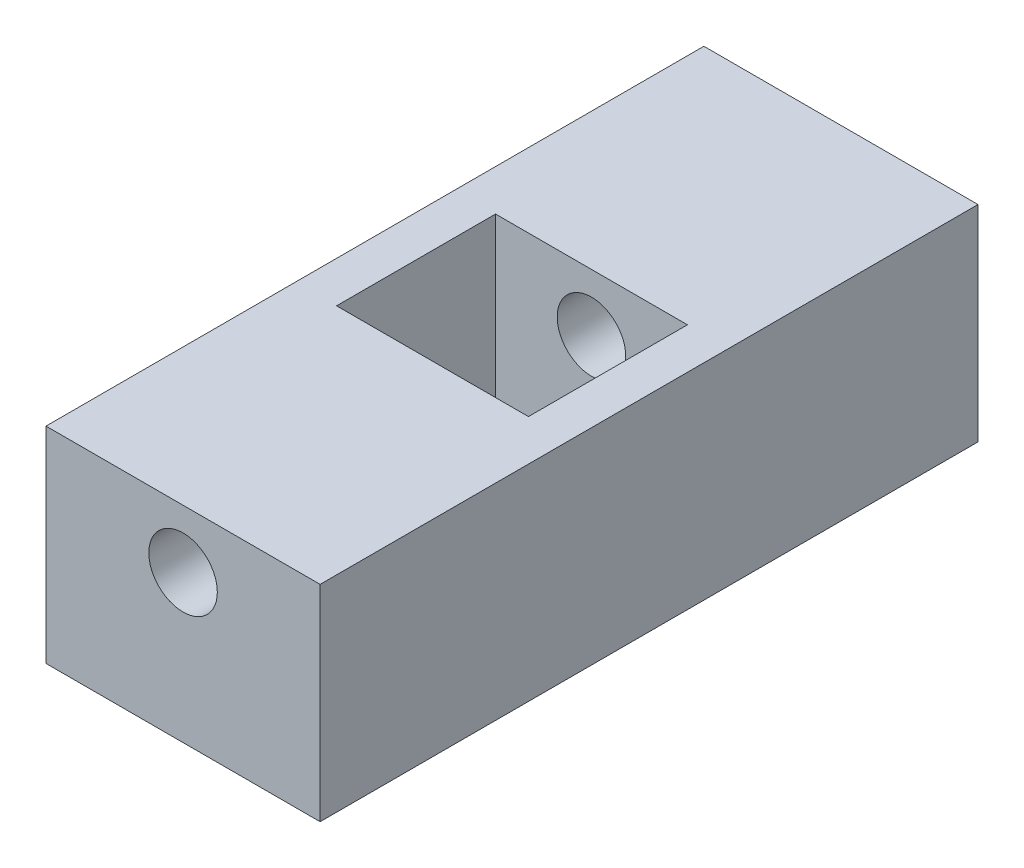
ISO-10303-21;
HEADER;
FILE_DESCRIPTION(('STEP AP214'),'2;1');
FILE_NAME('part.step','',(''),(''),'','','');
FILE_SCHEMA(('AUTOMOTIVE_DESIGN { 1 0 10303 214 1 1 1 1 }'));
ENDSEC;
DATA;
#1=APPLICATION_CONTEXT('core data for automotive mechanical design processes');
#2=APPLICATION_PROTOCOL_DEFINITION('international standard','automotive_design',2000,#1);
#3=PRODUCT_CONTEXT('',#1,'mechanical');
#4=PRODUCT('Part','Part','',(#3));
#5=PRODUCT_RELATED_PRODUCT_CATEGORY('part','',(#4));
#6=PRODUCT_DEFINITION_FORMATION('','',#4);
#7=PRODUCT_DEFINITION_CONTEXT('part definition',#1,'design');
#8=PRODUCT_DEFINITION('design','',#6,#7);
#9=PRODUCT_DEFINITION_SHAPE('','',#8);
#10=(LENGTH_UNIT() NAMED_UNIT(*) SI_UNIT(.MILLI.,.METRE.));
#11=(NAMED_UNIT(*) PLANE_ANGLE_UNIT() SI_UNIT($,.RADIAN.));
#12=(NAMED_UNIT(*) SI_UNIT($,.STERADIAN.) SOLID_ANGLE_UNIT());
#13=UNCERTAINTY_MEASURE_WITH_UNIT(LENGTH_MEASURE(1.E-05),#10,'distance_accuracy_value','');
#14=(GEOMETRIC_REPRESENTATION_CONTEXT(3) GLOBAL_UNCERTAINTY_ASSIGNED_CONTEXT((#13)) GLOBAL_UNIT_ASSIGNED_CONTEXT((#10,
#11,#12)) REPRESENTATION_CONTEXT('',''));
#15=CARTESIAN_POINT('',(0.,0.,0.));
#16=DIRECTION('',(0.,0.,1.));
#17=DIRECTION('',(1.,0.,0.));
#18=AXIS2_PLACEMENT_3D('',#15,#16,#17);
#19=CARTESIAN_POINT('',(0.,19.05,0.));
#20=DIRECTION('',(0.,0.,-1.));
#21=DIRECTION('',(-1.,0.,0.));
#22=AXIS2_PLACEMENT_3D('',#19,#20,#21);
#23=PLANE('',#22);
#24=CARTESIAN_POINT('',(12.7,13.6525,0.));
#25=DIRECTION('',(0.,0.,1.));
#26=DIRECTION('',(1.,0.,0.));
#27=AXIS2_PLACEMENT_3D('',#24,#25,#26);
#28=CIRCLE('',#27,3.175);
#29=CARTESIAN_POINT('',(15.875,13.6525,0.));
#30=VERTEX_POINT('',#29);
#31=EDGE_CURVE('E218',#30,#30,#28,.T.);
#32=ORIENTED_EDGE('',*,*,#31,.F.);
#33=EDGE_LOOP('',(#32));
#34=FACE_BOUND('',#33,.T.);
#35=DIRECTION('',(1.,0.,0.));
#36=VECTOR('',#35,1.);
#37=CARTESIAN_POINT('',(0.,0.,0.));
#38=LINE('',#37,#36);
#39=CARTESIAN_POINT('',(0.,0.,0.));
#40=VERTEX_POINT('',#39);
#41=CARTESIAN_POINT('',(25.4,0.,0.));
#42=VERTEX_POINT('',#41);
#43=EDGE_CURVE('E151',#40,#42,#38,.T.);
#44=ORIENTED_EDGE('',*,*,#43,.T.);
#45=DIRECTION('',(0.,-1.,0.));
#46=VECTOR('',#45,1.);
#47=CARTESIAN_POINT('',(25.4,19.05,0.));
#48=LINE('',#47,#46);
#49=CARTESIAN_POINT('',(25.4,19.05,0.));
#50=VERTEX_POINT('',#49);
#51=EDGE_CURVE('E11',#50,#42,#48,.T.);
#52=ORIENTED_EDGE('',*,*,#51,.F.);
#53=DIRECTION('',(1.,0.,0.));
#54=VECTOR('',#53,1.);
#55=CARTESIAN_POINT('',(0.,19.05,0.));
#56=LINE('',#55,#54);
#57=CARTESIAN_POINT('',(0.,19.05,0.));
#58=VERTEX_POINT('',#57);
#59=EDGE_CURVE('E157',#58,#50,#56,.T.);
#60=ORIENTED_EDGE('',*,*,#59,.F.);
#61=DIRECTION('',(0.,-1.,0.));
#62=VECTOR('',#61,1.);
#63=CARTESIAN_POINT('',(0.,19.05,0.));
#64=LINE('',#63,#62);
#65=EDGE_CURVE('E173',#58,#40,#64,.T.);
#66=ORIENTED_EDGE('',*,*,#65,.T.);
#67=EDGE_LOOP('',(#44,#52,#60,#66));
#68=FACE_BOUND('',#67,.T.);
#69=ADVANCED_FACE('F39',(#34,#68),#23,.F.);
#70=CARTESIAN_POINT('',(25.4,19.05,0.));
#71=DIRECTION('',(-1.,0.,0.));
#72=DIRECTION('',(0.,0.,1.));
#73=AXIS2_PLACEMENT_3D('',#70,#71,#72);
#74=PLANE('',#73);
#75=DIRECTION('',(0.,0.,-1.));
#76=VECTOR('',#75,1.);
#77=CARTESIAN_POINT('',(25.4,0.,0.));
#78=LINE('',#77,#76);
#79=CARTESIAN_POINT('',(25.4,0.,-60.96));
#80=VERTEX_POINT('',#79);
#81=EDGE_CURVE('E177',#42,#80,#78,.T.);
#82=ORIENTED_EDGE('',*,*,#81,.T.);
#83=DIRECTION('',(0.,-1.,0.));
#84=VECTOR('',#83,1.);
#85=CARTESIAN_POINT('',(25.4,19.05,-60.96));
#86=LINE('',#85,#84);
#87=CARTESIAN_POINT('',(25.4,19.05,-60.96));
#88=VERTEX_POINT('',#87);
#89=EDGE_CURVE('E48',#88,#80,#86,.T.);
#90=ORIENTED_EDGE('',*,*,#89,.F.);
#91=DIRECTION('',(0.,0.,-1.));
#92=VECTOR('',#91,1.);
#93=CARTESIAN_POINT('',(25.4,19.05,0.));
#94=LINE('',#93,#92);
#95=EDGE_CURVE('E161',#50,#88,#94,.T.);
#96=ORIENTED_EDGE('',*,*,#95,.F.);
#97=ORIENTED_EDGE('',*,*,#51,.T.);
#98=EDGE_LOOP('',(#82,#90,#96,#97));
#99=FACE_BOUND('',#98,.T.);
#100=ADVANCED_FACE('F200',(#99),#74,.F.);
#101=CARTESIAN_POINT('',(0.,19.05,-60.96));
#102=DIRECTION('',(0.,0.,-1.));
#103=DIRECTION('',(-1.,0.,0.));
#104=AXIS2_PLACEMENT_3D('',#101,#102,#103);
#105=PLANE('',#104);
#106=DIRECTION('',(1.,0.,0.));
#107=VECTOR('',#106,1.);
#108=CARTESIAN_POINT('',(0.,0.,-60.96));
#109=LINE('',#108,#107);
#110=CARTESIAN_POINT('',(0.,0.,-60.96));
#111=VERTEX_POINT('',#110);
#112=EDGE_CURVE('E181',#111,#80,#109,.T.);
#113=ORIENTED_EDGE('',*,*,#112,.F.);
#114=DIRECTION('',(0.,-1.,0.));
#115=VECTOR('',#114,1.);
#116=CARTESIAN_POINT('',(0.,19.05,-60.96));
#117=LINE('',#116,#115);
#118=CARTESIAN_POINT('',(0.,19.05,-60.96));
#119=VERTEX_POINT('',#118);
#120=EDGE_CURVE('E190',#119,#111,#117,.T.);
#121=ORIENTED_EDGE('',*,*,#120,.F.);
#122=DIRECTION('',(1.,0.,0.));
#123=VECTOR('',#122,1.);
#124=CARTESIAN_POINT('',(0.,19.05,-60.96));
#125=LINE('',#124,#123);
#126=EDGE_CURVE('E165',#119,#88,#125,.T.);
#127=ORIENTED_EDGE('',*,*,#126,.T.);
#128=ORIENTED_EDGE('',*,*,#89,.T.);
#129=EDGE_LOOP('',(#113,#121,#127,#128));
#130=FACE_BOUND('',#129,.T.);
#131=ADVANCED_FACE('F197',(#130),#105,.T.);
#132=CARTESIAN_POINT('',(0.,19.05,0.));
#133=DIRECTION('',(-1.,0.,0.));
#134=DIRECTION('',(0.,0.,1.));
#135=AXIS2_PLACEMENT_3D('',#132,#133,#134);
#136=PLANE('',#135);
#137=DIRECTION('',(0.,0.,-1.));
#138=VECTOR('',#137,1.);
#139=CARTESIAN_POINT('',(0.,0.,0.));
#140=LINE('',#139,#138);
#141=EDGE_CURVE('E162',#40,#111,#140,.T.);
#142=ORIENTED_EDGE('',*,*,#141,.F.);
#143=ORIENTED_EDGE('',*,*,#65,.F.);
#144=DIRECTION('',(0.,0.,-1.));
#145=VECTOR('',#144,1.);
#146=CARTESIAN_POINT('',(0.,19.05,0.));
#147=LINE('',#146,#145);
#148=EDGE_CURVE('E169',#58,#119,#147,.T.);
#149=ORIENTED_EDGE('',*,*,#148,.T.);
#150=ORIENTED_EDGE('',*,*,#120,.T.);
#151=EDGE_LOOP('',(#142,#143,#149,#150));
#152=FACE_BOUND('',#151,.T.);
#153=ADVANCED_FACE('F205',(#152),#136,.T.);
#154=CARTESIAN_POINT('',(0.,19.05,0.));
#155=DIRECTION('',(0.,1.,0.));
#156=DIRECTION('',(0.,0.,1.));
#157=AXIS2_PLACEMENT_3D('',#154,#155,#156);
#158=PLANE('',#157);
#159=DIRECTION('',(0.,0.,1.));
#160=VECTOR('',#159,1.);
#161=CARTESIAN_POINT('',(3.81,19.05,-37.846));
#162=LINE('',#161,#160);
#163=CARTESIAN_POINT('',(3.81,19.05,-37.846));
#164=VERTEX_POINT('',#163);
#165=CARTESIAN_POINT('',(3.81,19.05,-23.114));
#166=VERTEX_POINT('',#165);
#167=EDGE_CURVE('E55',#164,#166,#162,.T.);
#168=ORIENTED_EDGE('',*,*,#167,.F.);
#169=DIRECTION('',(-1.,0.,0.));
#170=VECTOR('',#169,1.);
#171=CARTESIAN_POINT('',(3.81,19.05,-37.846));
#172=LINE('',#171,#170);
#173=CARTESIAN_POINT('',(21.59,19.05,-37.846));
#174=VERTEX_POINT('',#173);
#175=EDGE_CURVE('E126',#174,#164,#172,.T.);
#176=ORIENTED_EDGE('',*,*,#175,.F.);
#177=DIRECTION('',(0.,0.,-1.));
#178=VECTOR('',#177,1.);
#179=CARTESIAN_POINT('',(21.59,19.05,-37.846));
#180=LINE('',#179,#178);
#181=CARTESIAN_POINT('',(21.59,19.05,-23.114));
#182=VERTEX_POINT('',#181);
#183=EDGE_CURVE('E130',#182,#174,#180,.T.);
#184=ORIENTED_EDGE('',*,*,#183,.F.);
#185=DIRECTION('',(1.,0.,0.));
#186=VECTOR('',#185,1.);
#187=CARTESIAN_POINT('',(3.81,19.05,-23.114));
#188=LINE('',#187,#186);
#189=EDGE_CURVE('E142',#166,#182,#188,.T.);
#190=ORIENTED_EDGE('',*,*,#189,.F.);
#191=EDGE_LOOP('',(#168,#176,#184,#190));
#192=FACE_BOUND('',#191,.T.);
#193=ORIENTED_EDGE('',*,*,#59,.T.);
#194=ORIENTED_EDGE('',*,*,#95,.T.);
#195=ORIENTED_EDGE('',*,*,#126,.F.);
#196=ORIENTED_EDGE('',*,*,#148,.F.);
#197=EDGE_LOOP('',(#193,#194,#195,#196));
#198=FACE_BOUND('',#197,.T.);
#199=ADVANCED_FACE('F209',(#192,#198),#158,.T.);
#200=CARTESIAN_POINT('',(0.,0.,0.));
#201=DIRECTION('',(0.,1.,0.));
#202=DIRECTION('',(0.,0.,1.));
#203=AXIS2_PLACEMENT_3D('',#200,#201,#202);
#204=PLANE('',#203);
#205=DIRECTION('',(-1.,0.,0.));
#206=VECTOR('',#205,1.);
#207=CARTESIAN_POINT('',(3.81,0.,-37.846));
#208=LINE('',#207,#206);
#209=CARTESIAN_POINT('',(21.59,0.,-37.846));
#210=VERTEX_POINT('',#209);
#211=CARTESIAN_POINT('',(3.81,0.,-37.846));
#212=VERTEX_POINT('',#211);
#213=EDGE_CURVE('E114',#210,#212,#208,.T.);
#214=ORIENTED_EDGE('',*,*,#213,.T.);
#215=DIRECTION('',(0.,0.,1.));
#216=VECTOR('',#215,1.);
#217=CARTESIAN_POINT('',(3.81,0.,-37.846));
#218=LINE('',#217,#216);
#219=CARTESIAN_POINT('',(3.81,0.,-23.114));
#220=VERTEX_POINT('',#219);
#221=EDGE_CURVE('E107',#212,#220,#218,.T.);
#222=ORIENTED_EDGE('',*,*,#221,.T.);
#223=DIRECTION('',(1.,0.,0.));
#224=VECTOR('',#223,1.);
#225=CARTESIAN_POINT('',(3.81,0.,-23.114));
#226=LINE('',#225,#224);
#227=CARTESIAN_POINT('',(21.59,0.,-23.114));
#228=VERTEX_POINT('',#227);
#229=EDGE_CURVE('E117',#220,#228,#226,.T.);
#230=ORIENTED_EDGE('',*,*,#229,.T.);
#231=DIRECTION('',(0.,0.,-1.));
#232=VECTOR('',#231,1.);
#233=CARTESIAN_POINT('',(21.59,0.,-37.846));
#234=LINE('',#233,#232);
#235=EDGE_CURVE('E63',#228,#210,#234,.T.);
#236=ORIENTED_EDGE('',*,*,#235,.T.);
#237=EDGE_LOOP('',(#214,#222,#230,#236));
#238=FACE_BOUND('',#237,.T.);
#239=ORIENTED_EDGE('',*,*,#43,.F.);
#240=ORIENTED_EDGE('',*,*,#141,.T.);
#241=ORIENTED_EDGE('',*,*,#112,.T.);
#242=ORIENTED_EDGE('',*,*,#81,.F.);
#243=EDGE_LOOP('',(#239,#240,#241,#242));
#244=FACE_BOUND('',#243,.T.);
#245=ADVANCED_FACE('F122',(#238,#244),#204,.F.);
#246=CARTESIAN_POINT('',(3.81,0.,-37.846));
#247=DIRECTION('',(-1.,0.,0.));
#248=DIRECTION('',(0.,0.,1.));
#249=AXIS2_PLACEMENT_3D('',#246,#247,#248);
#250=PLANE('',#249);
#251=ORIENTED_EDGE('',*,*,#167,.T.);
#252=DIRECTION('',(0.,1.,0.));
#253=VECTOR('',#252,1.);
#254=CARTESIAN_POINT('',(3.81,0.,-23.114));
#255=LINE('',#254,#253);
#256=EDGE_CURVE('E103',#220,#166,#255,.T.);
#257=ORIENTED_EDGE('',*,*,#256,.F.);
#258=ORIENTED_EDGE('',*,*,#221,.F.);
#259=DIRECTION('',(0.,1.,0.));
#260=VECTOR('',#259,1.);
#261=CARTESIAN_POINT('',(3.81,0.,-37.846));
#262=LINE('',#261,#260);
#263=EDGE_CURVE('E148',#212,#164,#262,.T.);
#264=ORIENTED_EDGE('',*,*,#263,.T.);
#265=EDGE_LOOP('',(#251,#257,#258,#264));
#266=FACE_BOUND('',#265,.T.);
#267=ADVANCED_FACE('F105',(#266),#250,.F.);
#268=CARTESIAN_POINT('',(3.81,0.,-37.846));
#269=DIRECTION('',(0.,0.,-1.));
#270=DIRECTION('',(-1.,0.,0.));
#271=AXIS2_PLACEMENT_3D('',#268,#269,#270);
#272=PLANE('',#271);
#273=CARTESIAN_POINT('',(12.7,13.6525,-37.846));
#274=DIRECTION('',(0.,0.,-1.));
#275=DIRECTION('',(-1.,0.,0.));
#276=AXIS2_PLACEMENT_3D('',#273,#274,#275);
#277=CIRCLE('',#276,3.175);
#278=CARTESIAN_POINT('',(15.875,13.6525,-37.846));
#279=VERTEX_POINT('',#278);
#280=EDGE_CURVE('E133',#279,#279,#277,.T.);
#281=ORIENTED_EDGE('',*,*,#280,.T.);
#282=EDGE_LOOP('',(#281));
#283=FACE_BOUND('',#282,.T.);
#284=ORIENTED_EDGE('',*,*,#175,.T.);
#285=ORIENTED_EDGE('',*,*,#263,.F.);
#286=ORIENTED_EDGE('',*,*,#213,.F.);
#287=DIRECTION('',(0.,1.,0.));
#288=VECTOR('',#287,1.);
#289=CARTESIAN_POINT('',(21.59,0.,-37.846));
#290=LINE('',#289,#288);
#291=EDGE_CURVE('E152',#210,#174,#290,.T.);
#292=ORIENTED_EDGE('',*,*,#291,.T.);
#293=EDGE_LOOP('',(#284,#285,#286,#292));
#294=FACE_BOUND('',#293,.T.);
#295=ADVANCED_FACE('F235',(#283,#294),#272,.F.);
#296=CARTESIAN_POINT('',(21.59,0.,-37.846));
#297=DIRECTION('',(1.,0.,0.));
#298=DIRECTION('',(0.,0.,-1.));
#299=AXIS2_PLACEMENT_3D('',#296,#297,#298);
#300=PLANE('',#299);
#301=ORIENTED_EDGE('',*,*,#183,.T.);
#302=ORIENTED_EDGE('',*,*,#291,.F.);
#303=ORIENTED_EDGE('',*,*,#235,.F.);
#304=DIRECTION('',(0.,1.,0.));
#305=VECTOR('',#304,1.);
#306=CARTESIAN_POINT('',(21.59,0.,-23.114));
#307=LINE('',#306,#305);
#308=EDGE_CURVE('E113',#228,#182,#307,.T.);
#309=ORIENTED_EDGE('',*,*,#308,.T.);
#310=EDGE_LOOP('',(#301,#302,#303,#309));
#311=FACE_BOUND('',#310,.T.);
#312=ADVANCED_FACE('F252',(#311),#300,.F.);
#313=CARTESIAN_POINT('',(3.81,0.,-23.114));
#314=DIRECTION('',(0.,0.,1.));
#315=DIRECTION('',(1.,0.,0.));
#316=AXIS2_PLACEMENT_3D('',#313,#314,#315);
#317=PLANE('',#316);
#318=CARTESIAN_POINT('',(12.7,13.6525,-23.114));
#319=DIRECTION('',(0.,0.,1.));
#320=DIRECTION('',(1.,0.,0.));
#321=AXIS2_PLACEMENT_3D('',#318,#319,#320);
#322=CIRCLE('',#321,3.175);
#323=CARTESIAN_POINT('',(15.875,13.6525,-23.114));
#324=VERTEX_POINT('',#323);
#325=EDGE_CURVE('E42',#324,#324,#322,.T.);
#326=ORIENTED_EDGE('',*,*,#325,.T.);
#327=EDGE_LOOP('',(#326));
#328=FACE_BOUND('',#327,.T.);
#329=ORIENTED_EDGE('',*,*,#189,.T.);
#330=ORIENTED_EDGE('',*,*,#308,.F.);
#331=ORIENTED_EDGE('',*,*,#229,.F.);
#332=ORIENTED_EDGE('',*,*,#256,.T.);
#333=EDGE_LOOP('',(#329,#330,#331,#332));
#334=FACE_BOUND('',#333,.T.);
#335=ADVANCED_FACE('F118',(#328,#334),#317,.F.);
#336=CARTESIAN_POINT('',(12.7,13.6525,-58.42));
#337=DIRECTION('',(0.,0.,1.));
#338=DIRECTION('',(1.,0.,0.));
#339=AXIS2_PLACEMENT_3D('',#336,#337,#338);
#340=CYLINDRICAL_SURFACE('',#339,3.175);
#341=CARTESIAN_POINT('',(15.875,13.6525,0.));
#342=CARTESIAN_POINT('',(15.875,13.6525,-0.240770833333334));
#343=CARTESIAN_POINT('',(15.875,13.6525,-0.481541666666668));
#344=CARTESIAN_POINT('',(15.875,13.6525,-0.963083333333334));
#345=CARTESIAN_POINT('',(15.875,13.6525,-1.20385416666667));
#346=CARTESIAN_POINT('',(15.875,13.6525,-1.68539583333333));
#347=CARTESIAN_POINT('',(15.875,13.6525,-1.92616666666667));
#348=CARTESIAN_POINT('',(15.875,13.6525,-2.40770833333333));
#349=CARTESIAN_POINT('',(15.875,13.6525,-2.64847916666667));
#350=CARTESIAN_POINT('',(15.875,13.6525,-3.13002083333333));
#351=CARTESIAN_POINT('',(15.875,13.6525,-3.37079166666667));
#352=CARTESIAN_POINT('',(15.875,13.6525,-3.85233333333333));
#353=CARTESIAN_POINT('',(15.875,13.6525,-4.09310416666667));
#354=CARTESIAN_POINT('',(15.875,13.6525,-4.57464583333334));
#355=CARTESIAN_POINT('',(15.875,13.6525,-4.81541666666667));
#356=CARTESIAN_POINT('',(15.875,13.6525,-5.29695833333334));
#357=CARTESIAN_POINT('',(15.875,13.6525,-5.53772916666667));
#358=CARTESIAN_POINT('',(15.875,13.6525,-6.01927083333334));
#359=CARTESIAN_POINT('',(15.875,13.6525,-6.26004166666667));
#360=CARTESIAN_POINT('',(15.875,13.6525,-6.74158333333334));
#361=CARTESIAN_POINT('',(15.875,13.6525,-6.98235416666667));
#362=CARTESIAN_POINT('',(15.875,13.6525,-7.46389583333334));
#363=CARTESIAN_POINT('',(15.875,13.6525,-7.70466666666667));
#364=CARTESIAN_POINT('',(15.875,13.6525,-8.18620833333333));
#365=CARTESIAN_POINT('',(15.875,13.6525,-8.42697916666667));
#366=CARTESIAN_POINT('',(15.875,13.6525,-8.90852083333334));
#367=CARTESIAN_POINT('',(15.875,13.6525,-9.14929166666667));
#368=CARTESIAN_POINT('',(15.875,13.6525,-9.63083333333334));
#369=CARTESIAN_POINT('',(15.875,13.6525,-9.87160416666667));
#370=CARTESIAN_POINT('',(15.875,13.6525,-10.3531458333333));
#371=CARTESIAN_POINT('',(15.875,13.6525,-10.5939166666667));
#372=CARTESIAN_POINT('',(15.875,13.6525,-11.0754583333333));
#373=CARTESIAN_POINT('',(15.875,13.6525,-11.3162291666667));
#374=CARTESIAN_POINT('',(15.875,13.6525,-11.7977708333333));
#375=CARTESIAN_POINT('',(15.875,13.6525,-12.0385416666667));
#376=CARTESIAN_POINT('',(15.875,13.6525,-12.5200833333333));
#377=CARTESIAN_POINT('',(15.875,13.6525,-12.7608541666667));
#378=CARTESIAN_POINT('',(15.875,13.6525,-13.2423958333333));
#379=CARTESIAN_POINT('',(15.875,13.6525,-13.4831666666667));
#380=CARTESIAN_POINT('',(15.875,13.6525,-13.9647083333333));
#381=CARTESIAN_POINT('',(15.875,13.6525,-14.2054791666667));
#382=CARTESIAN_POINT('',(15.875,13.6525,-14.6870208333333));
#383=CARTESIAN_POINT('',(15.875,13.6525,-14.9277916666667));
#384=CARTESIAN_POINT('',(15.875,13.6525,-15.4093333333333));
#385=CARTESIAN_POINT('',(15.875,13.6525,-15.6501041666667));
#386=CARTESIAN_POINT('',(15.875,13.6525,-16.1316458333333));
#387=CARTESIAN_POINT('',(15.875,13.6525,-16.3724166666667));
#388=CARTESIAN_POINT('',(15.875,13.6525,-16.8539583333333));
#389=CARTESIAN_POINT('',(15.875,13.6525,-17.0947291666667));
#390=CARTESIAN_POINT('',(15.875,13.6525,-17.5762708333333));
#391=CARTESIAN_POINT('',(15.875,13.6525,-17.8170416666667));
#392=CARTESIAN_POINT('',(15.875,13.6525,-18.2985833333333));
#393=CARTESIAN_POINT('',(15.875,13.6525,-18.5393541666667));
#394=CARTESIAN_POINT('',(15.875,13.6525,-19.0208958333333));
#395=CARTESIAN_POINT('',(15.875,13.6525,-19.2616666666667));
#396=CARTESIAN_POINT('',(15.875,13.6525,-19.7432083333333));
#397=CARTESIAN_POINT('',(15.875,13.6525,-19.9839791666667));
#398=CARTESIAN_POINT('',(15.875,13.6525,-20.4655208333333));
#399=CARTESIAN_POINT('',(15.875,13.6525,-20.7062916666667));
#400=CARTESIAN_POINT('',(15.875,13.6525,-21.1878333333333));
#401=CARTESIAN_POINT('',(15.875,13.6525,-21.4286041666667));
#402=CARTESIAN_POINT('',(15.875,13.6525,-21.9101458333333));
#403=CARTESIAN_POINT('',(15.875,13.6525,-22.1509166666667));
#404=CARTESIAN_POINT('',(15.875,13.6525,-22.6324583333333));
#405=CARTESIAN_POINT('',(15.875,13.6525,-22.8732291666667));
#406=CARTESIAN_POINT('',(15.875,13.6525,-23.114));
#407=B_SPLINE_CURVE_WITH_KNOTS('',3,(#341,#342,#343,#344,#345,#346,#347,#348,#349,#350,#351,
#352,#353,#354,#355,#356,#357,#358,#359,#360,#361,#362,#363,#364,#365,#366,#367,#368,#369,#370,
#371,#372,#373,#374,#375,#376,#377,#378,#379,#380,#381,#382,#383,#384,#385,#386,#387,#388,#389,
#390,#391,#392,#393,#394,#395,#396,#397,#398,#399,#400,#401,#402,#403,#404,#405,#406),
.UNSPECIFIED.,.F.,.F.,(4,2,2,2,2,2,2,2,2,2,2,2,2,2,2,2,2,2,2,2,2,2,2,2,2,2,2,2,2,2,2,2,4),(0.,
0.722312500000002,1.444625,2.1669375,2.88925,3.6115625,4.333875,5.0561875,5.77850000000001,
6.5008125,7.223125,7.9454375,8.66775,9.3900625,10.112375,10.8346875,11.557,12.2793125,13.001625,
13.7239375,14.44625,15.1685625,15.890875,16.6131875,17.3355,18.0578125,18.780125,19.5024375,
20.22475,20.9470625,21.669375,22.3916875,23.114),.UNSPECIFIED.);
#408=EDGE_CURVE('BSEAM241',#30,#324,#407,.T.);
#409=ORIENTED_EDGE('',*,*,#31,.T.);
#410=ORIENTED_EDGE('',*,*,#325,.F.);
#411=ORIENTED_EDGE('',*,*,#408,.T.);
#412=ORIENTED_EDGE('',*,*,#408,.F.);
#413=EDGE_LOOP('',(#409,#411,#410,#412));
#414=FACE_BOUND('',#413,.T.);
#415=ADVANCED_FACE('F241',(#414),#340,.F.);
#416=CARTESIAN_POINT('',(12.7,13.6525,-58.42));
#417=DIRECTION('',(0.,0.,1.));
#418=DIRECTION('',(1.,0.,0.));
#419=AXIS2_PLACEMENT_3D('',#416,#417,#418);
#420=CIRCLE('',#419,3.175);
#421=CARTESIAN_POINT('',(15.875,13.6525,-58.42));
#422=VERTEX_POINT('',#421);
#423=EDGE_CURVE('E221',#422,#422,#420,.T.);
#424=CARTESIAN_POINT('',(15.875,13.6525,-58.42));
#425=CARTESIAN_POINT('',(15.875,13.6525,-58.2056875));
#426=CARTESIAN_POINT('',(15.875,13.6525,-57.991375));
#427=CARTESIAN_POINT('',(15.875,13.6525,-57.56275));
#428=CARTESIAN_POINT('',(15.875,13.6525,-57.3484375));
#429=CARTESIAN_POINT('',(15.875,13.6525,-56.9198125));
#430=CARTESIAN_POINT('',(15.875,13.6525,-56.7055));
#431=CARTESIAN_POINT('',(15.875,13.6525,-56.276875));
#432=CARTESIAN_POINT('',(15.875,13.6525,-56.0625625));
#433=CARTESIAN_POINT('',(15.875,13.6525,-55.6339375));
#434=CARTESIAN_POINT('',(15.875,13.6525,-55.419625));
#435=CARTESIAN_POINT('',(15.875,13.6525,-54.991));
#436=CARTESIAN_POINT('',(15.875,13.6525,-54.7766875));
#437=CARTESIAN_POINT('',(15.875,13.6525,-54.3480625));
#438=CARTESIAN_POINT('',(15.875,13.6525,-54.13375));
#439=CARTESIAN_POINT('',(15.875,13.6525,-53.705125));
#440=CARTESIAN_POINT('',(15.875,13.6525,-53.4908125));
#441=CARTESIAN_POINT('',(15.875,13.6525,-53.0621875));
#442=CARTESIAN_POINT('',(15.875,13.6525,-52.847875));
#443=CARTESIAN_POINT('',(15.875,13.6525,-52.41925));
#444=CARTESIAN_POINT('',(15.875,13.6525,-52.2049375));
#445=CARTESIAN_POINT('',(15.875,13.6525,-51.7763125));
#446=CARTESIAN_POINT('',(15.875,13.6525,-51.562));
#447=CARTESIAN_POINT('',(15.875,13.6525,-51.133375));
#448=CARTESIAN_POINT('',(15.875,13.6525,-50.9190625));
#449=CARTESIAN_POINT('',(15.875,13.6525,-50.4904375));
#450=CARTESIAN_POINT('',(15.875,13.6525,-50.276125));
#451=CARTESIAN_POINT('',(15.875,13.6525,-49.8475));
#452=CARTESIAN_POINT('',(15.875,13.6525,-49.6331875));
#453=CARTESIAN_POINT('',(15.875,13.6525,-49.2045625));
#454=CARTESIAN_POINT('',(15.875,13.6525,-48.99025));
#455=CARTESIAN_POINT('',(15.875,13.6525,-48.561625));
#456=CARTESIAN_POINT('',(15.875,13.6525,-48.3473125));
#457=CARTESIAN_POINT('',(15.875,13.6525,-47.9186875));
#458=CARTESIAN_POINT('',(15.875,13.6525,-47.704375));
#459=CARTESIAN_POINT('',(15.875,13.6525,-47.27575));
#460=CARTESIAN_POINT('',(15.875,13.6525,-47.0614375));
#461=CARTESIAN_POINT('',(15.875,13.6525,-46.6328125));
#462=CARTESIAN_POINT('',(15.875,13.6525,-46.4185));
#463=CARTESIAN_POINT('',(15.875,13.6525,-45.989875));
#464=CARTESIAN_POINT('',(15.875,13.6525,-45.7755625));
#465=CARTESIAN_POINT('',(15.875,13.6525,-45.3469375));
#466=CARTESIAN_POINT('',(15.875,13.6525,-45.132625));
#467=CARTESIAN_POINT('',(15.875,13.6525,-44.704));
#468=CARTESIAN_POINT('',(15.875,13.6525,-44.4896875));
#469=CARTESIAN_POINT('',(15.875,13.6525,-44.0610625));
#470=CARTESIAN_POINT('',(15.875,13.6525,-43.84675));
#471=CARTESIAN_POINT('',(15.875,13.6525,-43.418125));
#472=CARTESIAN_POINT('',(15.875,13.6525,-43.2038125));
#473=CARTESIAN_POINT('',(15.875,13.6525,-42.7751875));
#474=CARTESIAN_POINT('',(15.875,13.6525,-42.560875));
#475=CARTESIAN_POINT('',(15.875,13.6525,-42.13225));
#476=CARTESIAN_POINT('',(15.875,13.6525,-41.9179375));
#477=CARTESIAN_POINT('',(15.875,13.6525,-41.4893125));
#478=CARTESIAN_POINT('',(15.875,13.6525,-41.275));
#479=CARTESIAN_POINT('',(15.875,13.6525,-40.846375));
#480=CARTESIAN_POINT('',(15.875,13.6525,-40.6320625));
#481=CARTESIAN_POINT('',(15.875,13.6525,-40.2034375));
#482=CARTESIAN_POINT('',(15.875,13.6525,-39.989125));
#483=CARTESIAN_POINT('',(15.875,13.6525,-39.5605));
#484=CARTESIAN_POINT('',(15.875,13.6525,-39.3461875));
#485=CARTESIAN_POINT('',(15.875,13.6525,-38.9175625));
#486=CARTESIAN_POINT('',(15.875,13.6525,-38.70325));
#487=CARTESIAN_POINT('',(15.875,13.6525,-38.274625));
#488=CARTESIAN_POINT('',(15.875,13.6525,-38.0603125));
#489=CARTESIAN_POINT('',(15.875,13.6525,-37.846));
#490=B_SPLINE_CURVE_WITH_KNOTS('',3,(#424,#425,#426,#427,#428,#429,#430,#431,#432,#433,#434,
#435,#436,#437,#438,#439,#440,#441,#442,#443,#444,#445,#446,#447,#448,#449,#450,#451,#452,#453,
#454,#455,#456,#457,#458,#459,#460,#461,#462,#463,#464,#465,#466,#467,#468,#469,#470,#471,#472,
#473,#474,#475,#476,#477,#478,#479,#480,#481,#482,#483,#484,#485,#486,#487,#488,#489),
.UNSPECIFIED.,.F.,.F.,(4,2,2,2,2,2,2,2,2,2,2,2,2,2,2,2,2,2,2,2,2,2,2,2,2,2,2,2,2,2,2,2,4),(0.,
0.642937499999996,1.285875,1.92881249999999,2.57175,3.21468749999999,3.857625,4.50056249999999,
5.1435,5.7864375,6.42937499999999,7.0723125,7.71524999999999,8.3581875,9.00112499999999,
9.6440625,10.287,10.9299375,11.572875,12.2158125,12.85875,13.5016875,14.144625,14.7875625,
15.4305,16.0734375,16.716375,17.3593125,18.00225,18.6451875,19.288125,19.9310625,20.574),.UNSPECIFIED.);
#491=EDGE_CURVE('BSEAM238',#422,#279,#490,.T.);
#492=ORIENTED_EDGE('',*,*,#423,.F.);
#493=ORIENTED_EDGE('',*,*,#280,.F.);
#494=ORIENTED_EDGE('',*,*,#491,.T.);
#495=ORIENTED_EDGE('',*,*,#491,.F.);
#496=EDGE_LOOP('',(#492,#494,#493,#495));
#497=FACE_BOUND('',#496,.T.);
#498=ADVANCED_FACE('F238',(#497),#340,.F.);
#499=CARTESIAN_POINT('',(12.7,13.6525,-58.42));
#500=DIRECTION('',(0.,0.,1.));
#501=DIRECTION('',(1.,0.,0.));
#502=AXIS2_PLACEMENT_3D('',#499,#500,#501);
#503=PLANE('',#502);
#504=ORIENTED_EDGE('',*,*,#423,.T.);
#505=EDGE_LOOP('',(#504));
#506=FACE_BOUND('',#505,.T.);
#507=ADVANCED_FACE('F240',(#506),#503,.T.);
#508=CLOSED_SHELL('',(#69,#100,#131,#153,#199,#245,#267,#295,#312,#335,#415,#498,#507));
#509=MANIFOLD_SOLID_BREP('B2',#508);
#510=ADVANCED_BREP_SHAPE_REPRESENTATION('',(#18,#509),#14);
#511=SHAPE_DEFINITION_REPRESENTATION(#9,#510);
ENDSEC;
END-ISO-10303-21;
